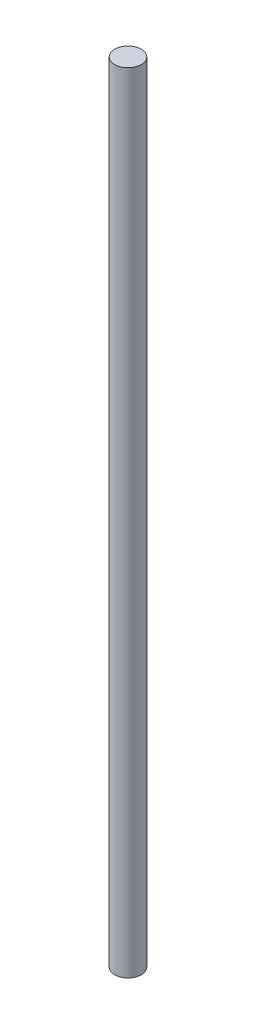
ISO-10303-21;
HEADER;
FILE_DESCRIPTION(('STEP AP214'),'2;1');
FILE_NAME('part.step','',(''),(''),'','','');
FILE_SCHEMA(('AUTOMOTIVE_DESIGN { 1 0 10303 214 1 1 1 1 }'));
ENDSEC;
DATA;
#1=APPLICATION_CONTEXT('core data for automotive mechanical design processes');
#2=APPLICATION_PROTOCOL_DEFINITION('international standard','automotive_design',2000,#1);
#3=PRODUCT_CONTEXT('',#1,'mechanical');
#4=PRODUCT('Part','Part','',(#3));
#5=PRODUCT_RELATED_PRODUCT_CATEGORY('part','',(#4));
#6=PRODUCT_DEFINITION_FORMATION('','',#4);
#7=PRODUCT_DEFINITION_CONTEXT('part definition',#1,'design');
#8=PRODUCT_DEFINITION('design','',#6,#7);
#9=PRODUCT_DEFINITION_SHAPE('','',#8);
#10=(LENGTH_UNIT() NAMED_UNIT(*) SI_UNIT(.MILLI.,.METRE.));
#11=(NAMED_UNIT(*) PLANE_ANGLE_UNIT() SI_UNIT($,.RADIAN.));
#12=(NAMED_UNIT(*) SI_UNIT($,.STERADIAN.) SOLID_ANGLE_UNIT());
#13=UNCERTAINTY_MEASURE_WITH_UNIT(LENGTH_MEASURE(1.E-05),#10,'distance_accuracy_value','');
#14=(GEOMETRIC_REPRESENTATION_CONTEXT(3) GLOBAL_UNCERTAINTY_ASSIGNED_CONTEXT((#13)) GLOBAL_UNIT_ASSIGNED_CONTEXT((#10,
#11,#12)) REPRESENTATION_CONTEXT('',''));
#15=CARTESIAN_POINT('',(0.,0.,0.));
#16=DIRECTION('',(0.,0.,1.));
#17=DIRECTION('',(1.,0.,0.));
#18=AXIS2_PLACEMENT_3D('',#15,#16,#17);
#19=CARTESIAN_POINT('',(0.,40.,0.));
#20=DIRECTION('',(0.,-1.,0.));
#21=DIRECTION('',(0.,0.,-1.));
#22=AXIS2_PLACEMENT_3D('',#19,#20,#21);
#23=CYLINDRICAL_SURFACE('',#22,0.675);
#24=CARTESIAN_POINT('',(0.,40.,0.));
#25=DIRECTION('',(0.,1.,0.));
#26=DIRECTION('',(0.,0.,1.));
#27=AXIS2_PLACEMENT_3D('',#24,#25,#26);
#28=CIRCLE('',#27,0.675);
#29=CARTESIAN_POINT('',(0.,40.,0.675));
#30=VERTEX_POINT('',#29);
#31=EDGE_CURVE('E10',#30,#30,#28,.T.);
#32=ORIENTED_EDGE('',*,*,#31,.F.);
#33=EDGE_LOOP('',(#32));
#34=FACE_BOUND('',#33,.T.);
#35=CARTESIAN_POINT('',(0.,0.,0.));
#36=DIRECTION('',(0.,1.,0.));
#37=DIRECTION('',(0.,0.,1.));
#38=AXIS2_PLACEMENT_3D('',#35,#36,#37);
#39=CIRCLE('',#38,0.675);
#40=CARTESIAN_POINT('',(0.,0.,0.675));
#41=VERTEX_POINT('',#40);
#42=EDGE_CURVE('E32',#41,#41,#39,.T.);
#43=ORIENTED_EDGE('',*,*,#42,.T.);
#44=EDGE_LOOP('',(#43));
#45=FACE_BOUND('',#44,.T.);
#46=ADVANCED_FACE('F29',(#34,#45),#23,.T.);
#47=CARTESIAN_POINT('',(0.,40.,0.));
#48=DIRECTION('',(0.,1.,0.));
#49=DIRECTION('',(0.,0.,1.));
#50=AXIS2_PLACEMENT_3D('',#47,#48,#49);
#51=PLANE('',#50);
#52=ORIENTED_EDGE('',*,*,#31,.T.);
#53=EDGE_LOOP('',(#52));
#54=FACE_BOUND('',#53,.T.);
#55=ADVANCED_FACE('F44',(#54),#51,.T.);
#56=CARTESIAN_POINT('',(0.,0.,0.));
#57=DIRECTION('',(0.,1.,0.));
#58=DIRECTION('',(0.,0.,1.));
#59=AXIS2_PLACEMENT_3D('',#56,#57,#58);
#60=PLANE('',#59);
#61=ORIENTED_EDGE('',*,*,#42,.F.);
#62=EDGE_LOOP('',(#61));
#63=FACE_BOUND('',#62,.T.);
#64=ADVANCED_FACE('F42',(#63),#60,.F.);
#65=CLOSED_SHELL('',(#46,#55,#64));
#66=MANIFOLD_SOLID_BREP('B2',#65);
#67=ADVANCED_BREP_SHAPE_REPRESENTATION('',(#18,#66),#14);
#68=SHAPE_DEFINITION_REPRESENTATION(#9,#67);
ENDSEC;
END-ISO-10303-21;
